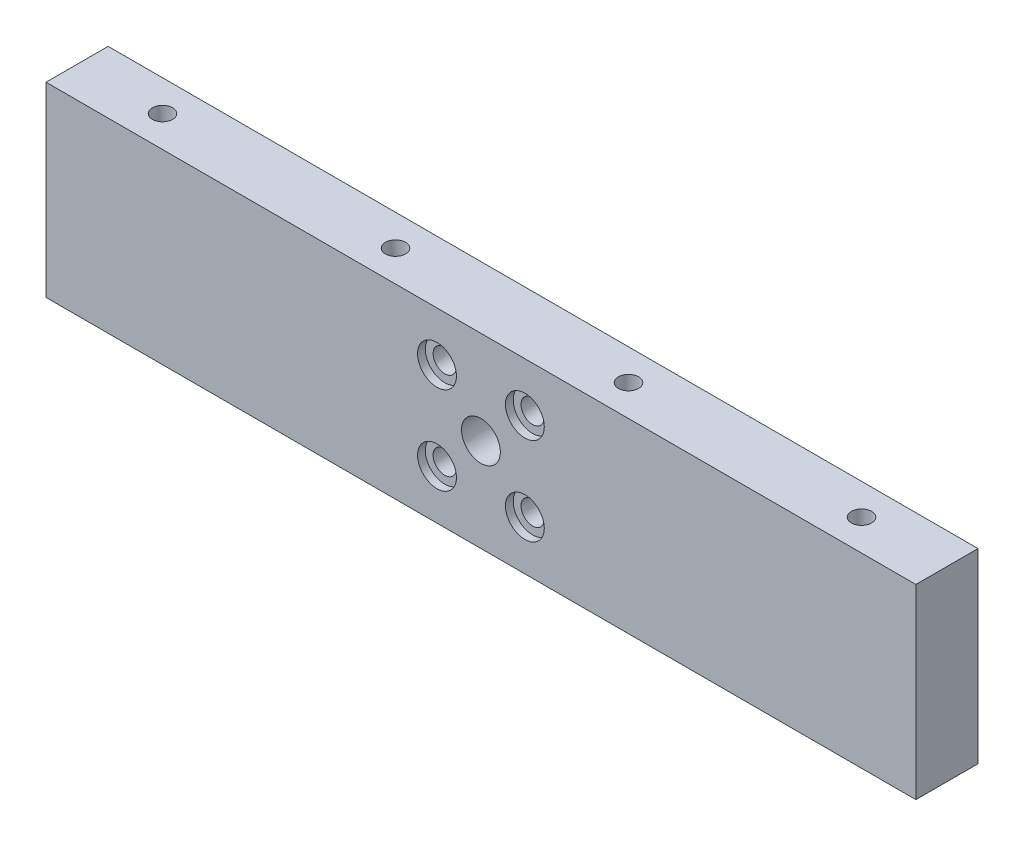
ISO-10303-21;
HEADER;
FILE_DESCRIPTION(('STEP AP214'),'2;1');
FILE_NAME('part.step','',(''),(''),'','','');
FILE_SCHEMA(('AUTOMOTIVE_DESIGN { 1 0 10303 214 1 1 1 1 }'));
ENDSEC;
DATA;
#1=APPLICATION_CONTEXT('core data for automotive mechanical design processes');
#2=APPLICATION_PROTOCOL_DEFINITION('international standard','automotive_design',2000,#1);
#3=PRODUCT_CONTEXT('',#1,'mechanical');
#4=PRODUCT('Part','Part','',(#3));
#5=PRODUCT_RELATED_PRODUCT_CATEGORY('part','',(#4));
#6=PRODUCT_DEFINITION_FORMATION('','',#4);
#7=PRODUCT_DEFINITION_CONTEXT('part definition',#1,'design');
#8=PRODUCT_DEFINITION('design','',#6,#7);
#9=PRODUCT_DEFINITION_SHAPE('','',#8);
#10=(LENGTH_UNIT() NAMED_UNIT(*) SI_UNIT(.MILLI.,.METRE.));
#11=(NAMED_UNIT(*) PLANE_ANGLE_UNIT() SI_UNIT($,.RADIAN.));
#12=(NAMED_UNIT(*) SI_UNIT($,.STERADIAN.) SOLID_ANGLE_UNIT());
#13=UNCERTAINTY_MEASURE_WITH_UNIT(LENGTH_MEASURE(1.E-05),#10,'distance_accuracy_value','');
#14=(GEOMETRIC_REPRESENTATION_CONTEXT(3) GLOBAL_UNCERTAINTY_ASSIGNED_CONTEXT((#13)) GLOBAL_UNIT_ASSIGNED_CONTEXT((#10,
#11,#12)) REPRESENTATION_CONTEXT('',''));
#15=CARTESIAN_POINT('',(0.,0.,0.));
#16=DIRECTION('',(0.,0.,1.));
#17=DIRECTION('',(1.,0.,0.));
#18=AXIS2_PLACEMENT_3D('',#15,#16,#17);
#19=CARTESIAN_POINT('',(-5.65685424949241,5.65685424949235,8.));
#20=DIRECTION('',(0.,0.,-1.));
#21=DIRECTION('',(-1.,0.,0.));
#22=AXIS2_PLACEMENT_3D('',#19,#20,#21);
#23=CYLINDRICAL_SURFACE('',#22,1.5);
#24=CARTESIAN_POINT('',(-5.65685424949241,5.65685424949235,0.));
#25=DIRECTION('',(0.,0.,-1.));
#26=DIRECTION('',(-1.,0.,0.));
#27=AXIS2_PLACEMENT_3D('',#24,#25,#26);
#28=CIRCLE('',#27,1.5);
#29=CARTESIAN_POINT('',(-7.15685424949241,5.65685424949235,0.));
#30=VERTEX_POINT('',#29);
#31=EDGE_CURVE('E162',#30,#30,#28,.T.);
#32=ORIENTED_EDGE('',*,*,#31,.T.);
#33=EDGE_LOOP('',(#32));
#34=FACE_BOUND('',#33,.T.);
#35=CARTESIAN_POINT('',(-5.65685424949241,5.65685424949235,7.));
#36=DIRECTION('',(0.,0.,1.));
#37=DIRECTION('',(1.,0.,0.));
#38=AXIS2_PLACEMENT_3D('',#35,#36,#37);
#39=CIRCLE('',#38,1.5);
#40=CARTESIAN_POINT('',(-4.15685424949241,5.65685424949235,7.));
#41=VERTEX_POINT('',#40);
#42=EDGE_CURVE('E39',#41,#41,#39,.F.);
#43=ORIENTED_EDGE('',*,*,#42,.F.);
#44=EDGE_LOOP('',(#43));
#45=FACE_BOUND('',#44,.T.);
#46=ADVANCED_FACE('F35',(#34,#45),#23,.F.);
#47=CARTESIAN_POINT('',(5.65685424949237,-5.65685424949239,8.));
#48=DIRECTION('',(0.,0.,-1.));
#49=DIRECTION('',(-1.,0.,0.));
#50=AXIS2_PLACEMENT_3D('',#47,#48,#49);
#51=CYLINDRICAL_SURFACE('',#50,1.5);
#52=CARTESIAN_POINT('',(5.65685424949237,-5.65685424949239,0.));
#53=DIRECTION('',(0.,0.,-1.));
#54=DIRECTION('',(-1.,0.,0.));
#55=AXIS2_PLACEMENT_3D('',#52,#53,#54);
#56=CIRCLE('',#55,1.5);
#57=CARTESIAN_POINT('',(4.15685424949237,-5.65685424949239,0.));
#58=VERTEX_POINT('',#57);
#59=EDGE_CURVE('E168',#58,#58,#56,.T.);
#60=ORIENTED_EDGE('',*,*,#59,.T.);
#61=EDGE_LOOP('',(#60));
#62=FACE_BOUND('',#61,.T.);
#63=CARTESIAN_POINT('',(5.65685424949237,-5.65685424949239,7.));
#64=DIRECTION('',(0.,0.,1.));
#65=DIRECTION('',(1.,0.,0.));
#66=AXIS2_PLACEMENT_3D('',#63,#64,#65);
#67=CIRCLE('',#66,1.5);
#68=CARTESIAN_POINT('',(7.15685424949237,-5.65685424949239,7.));
#69=VERTEX_POINT('',#68);
#70=EDGE_CURVE('E135',#69,#69,#67,.F.);
#71=ORIENTED_EDGE('',*,*,#70,.F.);
#72=EDGE_LOOP('',(#71));
#73=FACE_BOUND('',#72,.T.);
#74=ADVANCED_FACE('F202',(#62,#73),#51,.F.);
#75=CARTESIAN_POINT('',(5.65685424949239,5.65685424949237,8.));
#76=DIRECTION('',(0.,0.,-1.));
#77=DIRECTION('',(-1.,0.,0.));
#78=AXIS2_PLACEMENT_3D('',#75,#76,#77);
#79=CYLINDRICAL_SURFACE('',#78,1.49999999999999);
#80=CARTESIAN_POINT('',(5.65685424949239,5.65685424949237,0.));
#81=DIRECTION('',(0.,0.,-1.));
#82=DIRECTION('',(-1.,0.,0.));
#83=AXIS2_PLACEMENT_3D('',#80,#81,#82);
#84=CIRCLE('',#83,1.49999999999999);
#85=CARTESIAN_POINT('',(4.1568542494924,5.65685424949237,0.));
#86=VERTEX_POINT('',#85);
#87=EDGE_CURVE('E165',#86,#86,#84,.T.);
#88=ORIENTED_EDGE('',*,*,#87,.T.);
#89=EDGE_LOOP('',(#88));
#90=FACE_BOUND('',#89,.T.);
#91=CARTESIAN_POINT('',(5.65685424949239,5.65685424949237,7.));
#92=DIRECTION('',(0.,0.,1.));
#93=DIRECTION('',(1.,0.,0.));
#94=AXIS2_PLACEMENT_3D('',#91,#92,#93);
#95=CIRCLE('',#94,1.49999999999999);
#96=CARTESIAN_POINT('',(7.15685424949238,5.65685424949237,7.));
#97=VERTEX_POINT('',#96);
#98=EDGE_CURVE('E131',#97,#97,#95,.F.);
#99=ORIENTED_EDGE('',*,*,#98,.F.);
#100=EDGE_LOOP('',(#99));
#101=FACE_BOUND('',#100,.T.);
#102=ADVANCED_FACE('F208',(#90,#101),#79,.F.);
#103=CARTESIAN_POINT('',(-5.65685424949233,-5.65685424949243,8.));
#104=DIRECTION('',(0.,0.,-1.));
#105=DIRECTION('',(-1.,0.,0.));
#106=AXIS2_PLACEMENT_3D('',#103,#104,#105);
#107=CYLINDRICAL_SURFACE('',#106,1.5);
#108=CARTESIAN_POINT('',(-5.65685424949233,-5.65685424949243,0.));
#109=DIRECTION('',(0.,0.,-1.));
#110=DIRECTION('',(-1.,0.,0.));
#111=AXIS2_PLACEMENT_3D('',#108,#109,#110);
#112=CIRCLE('',#111,1.5);
#113=CARTESIAN_POINT('',(-7.15685424949233,-5.65685424949243,0.));
#114=VERTEX_POINT('',#113);
#115=EDGE_CURVE('E129',#114,#114,#112,.T.);
#116=ORIENTED_EDGE('',*,*,#115,.T.);
#117=EDGE_LOOP('',(#116));
#118=FACE_BOUND('',#117,.T.);
#119=CARTESIAN_POINT('',(-5.65685424949233,-5.65685424949243,7.));
#120=DIRECTION('',(0.,0.,1.));
#121=DIRECTION('',(1.,0.,0.));
#122=AXIS2_PLACEMENT_3D('',#119,#120,#121);
#123=CIRCLE('',#122,1.5);
#124=CARTESIAN_POINT('',(-4.15685424949233,-5.65685424949243,7.));
#125=VERTEX_POINT('',#124);
#126=EDGE_CURVE('E126',#125,#125,#123,.F.);
#127=ORIENTED_EDGE('',*,*,#126,.F.);
#128=EDGE_LOOP('',(#127));
#129=FACE_BOUND('',#128,.T.);
#130=ADVANCED_FACE('F197',(#118,#129),#107,.F.);
#131=CARTESIAN_POINT('',(56.,-12.,8.));
#132=DIRECTION('',(-1.,0.,0.));
#133=DIRECTION('',(0.,0.,1.));
#134=AXIS2_PLACEMENT_3D('',#131,#132,#133);
#135=PLANE('',#134);
#136=DIRECTION('',(0.,1.,0.));
#137=VECTOR('',#136,1.);
#138=CARTESIAN_POINT('',(56.,-12.,0.));
#139=LINE('',#138,#137);
#140=CARTESIAN_POINT('',(56.,-12.,0.));
#141=VERTEX_POINT('',#140);
#142=CARTESIAN_POINT('',(56.,12.,0.));
#143=VERTEX_POINT('',#142);
#144=EDGE_CURVE('E102',#141,#143,#139,.T.);
#145=ORIENTED_EDGE('',*,*,#144,.T.);
#146=DIRECTION('',(0.,0.,-1.));
#147=VECTOR('',#146,1.);
#148=CARTESIAN_POINT('',(56.,12.,8.));
#149=LINE('',#148,#147);
#150=CARTESIAN_POINT('',(56.,12.,8.));
#151=VERTEX_POINT('',#150);
#152=EDGE_CURVE('E11',#151,#143,#149,.T.);
#153=ORIENTED_EDGE('',*,*,#152,.F.);
#154=DIRECTION('',(0.,1.,0.));
#155=VECTOR('',#154,1.);
#156=CARTESIAN_POINT('',(56.,-12.,8.));
#157=LINE('',#156,#155);
#158=CARTESIAN_POINT('',(56.,-12.,8.));
#159=VERTEX_POINT('',#158);
#160=EDGE_CURVE('E89',#159,#151,#157,.T.);
#161=ORIENTED_EDGE('',*,*,#160,.F.);
#162=DIRECTION('',(0.,0.,-1.));
#163=VECTOR('',#162,1.);
#164=CARTESIAN_POINT('',(56.,-12.,8.));
#165=LINE('',#164,#163);
#166=EDGE_CURVE('E98',#159,#141,#165,.T.);
#167=ORIENTED_EDGE('',*,*,#166,.T.);
#168=EDGE_LOOP('',(#145,#153,#161,#167));
#169=FACE_BOUND('',#168,.T.);
#170=ADVANCED_FACE('F37',(#169),#135,.F.);
#171=CARTESIAN_POINT('',(-56.,12.,8.));
#172=DIRECTION('',(0.,-1.,0.));
#173=DIRECTION('',(0.,0.,-1.));
#174=AXIS2_PLACEMENT_3D('',#171,#172,#173);
#175=PLANE('',#174);
#176=CARTESIAN_POINT('',(15.0000000000001,12.,4.));
#177=DIRECTION('',(0.,1.,0.));
#178=DIRECTION('',(0.,0.,-1.));
#179=AXIS2_PLACEMENT_3D('',#176,#177,#178);
#180=CIRCLE('',#179,1.3);
#181=CARTESIAN_POINT('',(15.0000000000001,12.,2.7));
#182=VERTEX_POINT('',#181);
#183=EDGE_CURVE('E125',#182,#182,#180,.T.);
#184=ORIENTED_EDGE('',*,*,#183,.F.);
#185=EDGE_LOOP('',(#184));
#186=FACE_BOUND('',#185,.T.);
#187=CARTESIAN_POINT('',(45.0000000000001,12.,4.));
#188=DIRECTION('',(0.,1.,0.));
#189=DIRECTION('',(0.,0.,-1.));
#190=AXIS2_PLACEMENT_3D('',#187,#188,#189);
#191=CIRCLE('',#190,1.3);
#192=CARTESIAN_POINT('',(45.0000000000001,12.,2.7));
#193=VERTEX_POINT('',#192);
#194=EDGE_CURVE('E121',#193,#193,#191,.T.);
#195=ORIENTED_EDGE('',*,*,#194,.F.);
#196=EDGE_LOOP('',(#195));
#197=FACE_BOUND('',#196,.T.);
#198=CARTESIAN_POINT('',(-45.,12.,4.));
#199=DIRECTION('',(0.,1.,0.));
#200=DIRECTION('',(0.,0.,1.));
#201=AXIS2_PLACEMENT_3D('',#198,#199,#200);
#202=CIRCLE('',#201,1.3);
#203=CARTESIAN_POINT('',(-45.,12.,5.3));
#204=VERTEX_POINT('',#203);
#205=EDGE_CURVE('E117',#204,#204,#202,.T.);
#206=ORIENTED_EDGE('',*,*,#205,.F.);
#207=EDGE_LOOP('',(#206));
#208=FACE_BOUND('',#207,.T.);
#209=CARTESIAN_POINT('',(-15.,12.,4.));
#210=DIRECTION('',(0.,1.,0.));
#211=DIRECTION('',(0.,0.,1.));
#212=AXIS2_PLACEMENT_3D('',#209,#210,#211);
#213=CIRCLE('',#212,1.3);
#214=CARTESIAN_POINT('',(-15.,12.,5.3));
#215=VERTEX_POINT('',#214);
#216=EDGE_CURVE('E113',#215,#215,#213,.T.);
#217=ORIENTED_EDGE('',*,*,#216,.F.);
#218=EDGE_LOOP('',(#217));
#219=FACE_BOUND('',#218,.T.);
#220=DIRECTION('',(-1.,0.,0.));
#221=VECTOR('',#220,1.);
#222=CARTESIAN_POINT('',(-56.,12.,0.));
#223=LINE('',#222,#221);
#224=CARTESIAN_POINT('',(-56.,12.,0.));
#225=VERTEX_POINT('',#224);
#226=EDGE_CURVE('E93',#143,#225,#223,.T.);
#227=ORIENTED_EDGE('',*,*,#226,.T.);
#228=DIRECTION('',(0.,0.,-1.));
#229=VECTOR('',#228,1.);
#230=CARTESIAN_POINT('',(-56.,12.,8.));
#231=LINE('',#230,#229);
#232=CARTESIAN_POINT('',(-56.,12.,8.));
#233=VERTEX_POINT('',#232);
#234=EDGE_CURVE('E45',#233,#225,#231,.T.);
#235=ORIENTED_EDGE('',*,*,#234,.F.);
#236=DIRECTION('',(-1.,0.,0.));
#237=VECTOR('',#236,1.);
#238=CARTESIAN_POINT('',(-56.,12.,8.));
#239=LINE('',#238,#237);
#240=EDGE_CURVE('E84',#151,#233,#239,.T.);
#241=ORIENTED_EDGE('',*,*,#240,.F.);
#242=ORIENTED_EDGE('',*,*,#152,.T.);
#243=EDGE_LOOP('',(#227,#235,#241,#242));
#244=FACE_BOUND('',#243,.T.);
#245=ADVANCED_FACE('F92',(#186,#197,#208,#219,#244),#175,.F.);
#246=CARTESIAN_POINT('',(-56.,-12.,8.));
#247=DIRECTION('',(1.,0.,0.));
#248=DIRECTION('',(0.,0.,-1.));
#249=AXIS2_PLACEMENT_3D('',#246,#247,#248);
#250=PLANE('',#249);
#251=DIRECTION('',(0.,-1.,0.));
#252=VECTOR('',#251,1.);
#253=CARTESIAN_POINT('',(-56.,-12.,0.));
#254=LINE('',#253,#252);
#255=CARTESIAN_POINT('',(-56.,-12.,0.));
#256=VERTEX_POINT('',#255);
#257=EDGE_CURVE('E71',#225,#256,#254,.T.);
#258=ORIENTED_EDGE('',*,*,#257,.T.);
#259=DIRECTION('',(0.,0.,-1.));
#260=VECTOR('',#259,1.);
#261=CARTESIAN_POINT('',(-56.,-12.,8.));
#262=LINE('',#261,#260);
#263=CARTESIAN_POINT('',(-56.,-12.,8.));
#264=VERTEX_POINT('',#263);
#265=EDGE_CURVE('E94',#264,#256,#262,.T.);
#266=ORIENTED_EDGE('',*,*,#265,.F.);
#267=DIRECTION('',(0.,-1.,0.));
#268=VECTOR('',#267,1.);
#269=CARTESIAN_POINT('',(-56.,-12.,8.));
#270=LINE('',#269,#268);
#271=EDGE_CURVE('E87',#233,#264,#270,.T.);
#272=ORIENTED_EDGE('',*,*,#271,.F.);
#273=ORIENTED_EDGE('',*,*,#234,.T.);
#274=EDGE_LOOP('',(#258,#266,#272,#273));
#275=FACE_BOUND('',#274,.T.);
#276=ADVANCED_FACE('F96',(#275),#250,.F.);
#277=CARTESIAN_POINT('',(-56.,-12.,8.));
#278=DIRECTION('',(0.,1.,0.));
#279=DIRECTION('',(0.,0.,1.));
#280=AXIS2_PLACEMENT_3D('',#277,#278,#279);
#281=PLANE('',#280);
#282=CARTESIAN_POINT('',(15.0000000000001,-12.,4.));
#283=DIRECTION('',(0.,1.,0.));
#284=DIRECTION('',(0.,0.,1.));
#285=AXIS2_PLACEMENT_3D('',#282,#283,#284);
#286=CIRCLE('',#285,1.3);
#287=CARTESIAN_POINT('',(15.0000000000001,-12.,5.3));
#288=VERTEX_POINT('',#287);
#289=EDGE_CURVE('E122',#288,#288,#286,.T.);
#290=ORIENTED_EDGE('',*,*,#289,.T.);
#291=EDGE_LOOP('',(#290));
#292=FACE_BOUND('',#291,.T.);
#293=CARTESIAN_POINT('',(45.0000000000001,-12.,4.));
#294=DIRECTION('',(0.,1.,0.));
#295=DIRECTION('',(0.,0.,1.));
#296=AXIS2_PLACEMENT_3D('',#293,#294,#295);
#297=CIRCLE('',#296,1.3);
#298=CARTESIAN_POINT('',(45.0000000000001,-12.,5.3));
#299=VERTEX_POINT('',#298);
#300=EDGE_CURVE('E118',#299,#299,#297,.T.);
#301=ORIENTED_EDGE('',*,*,#300,.T.);
#302=EDGE_LOOP('',(#301));
#303=FACE_BOUND('',#302,.T.);
#304=CARTESIAN_POINT('',(-45.,-12.,4.));
#305=DIRECTION('',(0.,1.,0.));
#306=DIRECTION('',(0.,0.,1.));
#307=AXIS2_PLACEMENT_3D('',#304,#305,#306);
#308=CIRCLE('',#307,1.3);
#309=CARTESIAN_POINT('',(-45.,-12.,5.3));
#310=VERTEX_POINT('',#309);
#311=EDGE_CURVE('E114',#310,#310,#308,.T.);
#312=ORIENTED_EDGE('',*,*,#311,.T.);
#313=EDGE_LOOP('',(#312));
#314=FACE_BOUND('',#313,.T.);
#315=CARTESIAN_POINT('',(-15.,-12.,4.));
#316=DIRECTION('',(0.,1.,0.));
#317=DIRECTION('',(0.,0.,1.));
#318=AXIS2_PLACEMENT_3D('',#315,#316,#317);
#319=CIRCLE('',#318,1.3);
#320=CARTESIAN_POINT('',(-15.,-12.,5.3));
#321=VERTEX_POINT('',#320);
#322=EDGE_CURVE('E105',#321,#321,#319,.T.);
#323=ORIENTED_EDGE('',*,*,#322,.T.);
#324=EDGE_LOOP('',(#323));
#325=FACE_BOUND('',#324,.T.);
#326=DIRECTION('',(1.,0.,0.));
#327=VECTOR('',#326,1.);
#328=CARTESIAN_POINT('',(-56.,-12.,0.));
#329=LINE('',#328,#327);
#330=EDGE_CURVE('E77',#256,#141,#329,.T.);
#331=ORIENTED_EDGE('',*,*,#330,.T.);
#332=ORIENTED_EDGE('',*,*,#166,.F.);
#333=DIRECTION('',(1.,0.,0.));
#334=VECTOR('',#333,1.);
#335=CARTESIAN_POINT('',(-56.,-12.,8.));
#336=LINE('',#335,#334);
#337=EDGE_CURVE('E54',#264,#159,#336,.T.);
#338=ORIENTED_EDGE('',*,*,#337,.F.);
#339=ORIENTED_EDGE('',*,*,#265,.T.);
#340=EDGE_LOOP('',(#331,#332,#338,#339));
#341=FACE_BOUND('',#340,.T.);
#342=ADVANCED_FACE('F195',(#292,#303,#314,#325,#341),#281,.F.);
#343=CARTESIAN_POINT('',(0.,0.,8.));
#344=DIRECTION('',(0.,0.,-1.));
#345=DIRECTION('',(-1.,0.,0.));
#346=AXIS2_PLACEMENT_3D('',#343,#344,#345);
#347=PLANE('',#346);
#348=CARTESIAN_POINT('',(-5.65685424949241,5.65685424949235,8.));
#349=DIRECTION('',(0.,0.,1.));
#350=DIRECTION('',(1.,0.,0.));
#351=AXIS2_PLACEMENT_3D('',#348,#349,#350);
#352=CIRCLE('',#351,2.5);
#353=CARTESIAN_POINT('',(-3.15685424949241,5.65685424949235,8.));
#354=VERTEX_POINT('',#353);
#355=EDGE_CURVE('E151',#354,#354,#352,.T.);
#356=ORIENTED_EDGE('',*,*,#355,.F.);
#357=EDGE_LOOP('',(#356));
#358=FACE_BOUND('',#357,.T.);
#359=CARTESIAN_POINT('',(5.65685424949237,-5.65685424949239,8.));
#360=DIRECTION('',(0.,0.,1.));
#361=DIRECTION('',(1.,0.,0.));
#362=AXIS2_PLACEMENT_3D('',#359,#360,#361);
#363=CIRCLE('',#362,2.5);
#364=CARTESIAN_POINT('',(8.15685424949237,-5.65685424949239,8.));
#365=VERTEX_POINT('',#364);
#366=EDGE_CURVE('E144',#365,#365,#363,.T.);
#367=ORIENTED_EDGE('',*,*,#366,.F.);
#368=EDGE_LOOP('',(#367));
#369=FACE_BOUND('',#368,.T.);
#370=CARTESIAN_POINT('',(5.65685424949239,5.65685424949237,8.));
#371=DIRECTION('',(0.,0.,1.));
#372=DIRECTION('',(1.,0.,0.));
#373=AXIS2_PLACEMENT_3D('',#370,#371,#372);
#374=CIRCLE('',#373,2.5);
#375=CARTESIAN_POINT('',(8.15685424949239,5.65685424949237,8.));
#376=VERTEX_POINT('',#375);
#377=EDGE_CURVE('E137',#376,#376,#374,.T.);
#378=ORIENTED_EDGE('',*,*,#377,.F.);
#379=EDGE_LOOP('',(#378));
#380=FACE_BOUND('',#379,.T.);
#381=CARTESIAN_POINT('',(-5.65685424949233,-5.65685424949243,8.));
#382=DIRECTION('',(0.,0.,1.));
#383=DIRECTION('',(1.,0.,0.));
#384=AXIS2_PLACEMENT_3D('',#381,#382,#383);
#385=CIRCLE('',#384,2.5);
#386=CARTESIAN_POINT('',(-3.15685424949233,-5.65685424949243,8.));
#387=VERTEX_POINT('',#386);
#388=EDGE_CURVE('E133',#387,#387,#385,.T.);
#389=ORIENTED_EDGE('',*,*,#388,.F.);
#390=EDGE_LOOP('',(#389));
#391=FACE_BOUND('',#390,.T.);
#392=CARTESIAN_POINT('',(0.,0.,8.));
#393=DIRECTION('',(0.,0.,-1.));
#394=DIRECTION('',(-1.,0.,0.));
#395=AXIS2_PLACEMENT_3D('',#392,#393,#394);
#396=CIRCLE('',#395,2.5);
#397=CARTESIAN_POINT('',(-2.5,0.,8.));
#398=VERTEX_POINT('',#397);
#399=EDGE_CURVE('E172',#398,#398,#396,.T.);
#400=ORIENTED_EDGE('',*,*,#399,.T.);
#401=EDGE_LOOP('',(#400));
#402=FACE_BOUND('',#401,.T.);
#403=ORIENTED_EDGE('',*,*,#160,.T.);
#404=ORIENTED_EDGE('',*,*,#240,.T.);
#405=ORIENTED_EDGE('',*,*,#271,.T.);
#406=ORIENTED_EDGE('',*,*,#337,.T.);
#407=EDGE_LOOP('',(#403,#404,#405,#406));
#408=FACE_BOUND('',#407,.T.);
#409=ADVANCED_FACE('F85',(#358,#369,#380,#391,#402,#408),#347,.F.);
#410=CARTESIAN_POINT('',(0.,0.,0.));
#411=DIRECTION('',(0.,0.,-1.));
#412=DIRECTION('',(-1.,0.,0.));
#413=AXIS2_PLACEMENT_3D('',#410,#411,#412);
#414=PLANE('',#413);
#415=ORIENTED_EDGE('',*,*,#115,.F.);
#416=EDGE_LOOP('',(#415));
#417=FACE_BOUND('',#416,.T.);
#418=ORIENTED_EDGE('',*,*,#31,.F.);
#419=EDGE_LOOP('',(#418));
#420=FACE_BOUND('',#419,.T.);
#421=ORIENTED_EDGE('',*,*,#87,.F.);
#422=EDGE_LOOP('',(#421));
#423=FACE_BOUND('',#422,.T.);
#424=ORIENTED_EDGE('',*,*,#59,.F.);
#425=EDGE_LOOP('',(#424));
#426=FACE_BOUND('',#425,.T.);
#427=CARTESIAN_POINT('',(0.,0.,0.));
#428=DIRECTION('',(0.,0.,-1.));
#429=DIRECTION('',(-1.,0.,0.));
#430=AXIS2_PLACEMENT_3D('',#427,#428,#429);
#431=CIRCLE('',#430,2.5);
#432=CARTESIAN_POINT('',(-2.5,0.,0.));
#433=VERTEX_POINT('',#432);
#434=EDGE_CURVE('E171',#433,#433,#431,.T.);
#435=ORIENTED_EDGE('',*,*,#434,.F.);
#436=EDGE_LOOP('',(#435));
#437=FACE_BOUND('',#436,.T.);
#438=ORIENTED_EDGE('',*,*,#144,.F.);
#439=ORIENTED_EDGE('',*,*,#330,.F.);
#440=ORIENTED_EDGE('',*,*,#257,.F.);
#441=ORIENTED_EDGE('',*,*,#226,.F.);
#442=EDGE_LOOP('',(#438,#439,#440,#441));
#443=FACE_BOUND('',#442,.T.);
#444=ADVANCED_FACE('F237',(#417,#420,#423,#426,#437,#443),#414,.T.);
#445=CARTESIAN_POINT('',(-15.,-18.,4.));
#446=DIRECTION('',(0.,1.,0.));
#447=DIRECTION('',(0.,0.,1.));
#448=AXIS2_PLACEMENT_3D('',#445,#446,#447);
#449=CYLINDRICAL_SURFACE('',#448,1.3);
#450=ORIENTED_EDGE('',*,*,#216,.T.);
#451=EDGE_LOOP('',(#450));
#452=FACE_BOUND('',#451,.T.);
#453=ORIENTED_EDGE('',*,*,#322,.F.);
#454=EDGE_LOOP('',(#453));
#455=FACE_BOUND('',#454,.T.);
#456=ADVANCED_FACE('F186',(#452,#455),#449,.F.);
#457=CARTESIAN_POINT('',(-45.,-18.,4.));
#458=DIRECTION('',(0.,1.,0.));
#459=DIRECTION('',(0.,0.,1.));
#460=AXIS2_PLACEMENT_3D('',#457,#458,#459);
#461=CYLINDRICAL_SURFACE('',#460,1.3);
#462=ORIENTED_EDGE('',*,*,#205,.T.);
#463=EDGE_LOOP('',(#462));
#464=FACE_BOUND('',#463,.T.);
#465=ORIENTED_EDGE('',*,*,#311,.F.);
#466=EDGE_LOOP('',(#465));
#467=FACE_BOUND('',#466,.T.);
#468=ADVANCED_FACE('F230',(#464,#467),#461,.F.);
#469=CARTESIAN_POINT('',(45.0000000000001,-18.,4.));
#470=DIRECTION('',(0.,1.,0.));
#471=DIRECTION('',(0.,0.,1.));
#472=AXIS2_PLACEMENT_3D('',#469,#470,#471);
#473=CYLINDRICAL_SURFACE('',#472,1.3);
#474=ORIENTED_EDGE('',*,*,#194,.T.);
#475=EDGE_LOOP('',(#474));
#476=FACE_BOUND('',#475,.T.);
#477=ORIENTED_EDGE('',*,*,#300,.F.);
#478=EDGE_LOOP('',(#477));
#479=FACE_BOUND('',#478,.T.);
#480=ADVANCED_FACE('F226',(#476,#479),#473,.F.);
#481=CARTESIAN_POINT('',(15.0000000000001,-18.,4.));
#482=DIRECTION('',(0.,1.,0.));
#483=DIRECTION('',(0.,0.,1.));
#484=AXIS2_PLACEMENT_3D('',#481,#482,#483);
#485=CYLINDRICAL_SURFACE('',#484,1.3);
#486=ORIENTED_EDGE('',*,*,#183,.T.);
#487=EDGE_LOOP('',(#486));
#488=FACE_BOUND('',#487,.T.);
#489=ORIENTED_EDGE('',*,*,#289,.F.);
#490=EDGE_LOOP('',(#489));
#491=FACE_BOUND('',#490,.T.);
#492=ADVANCED_FACE('F222',(#488,#491),#485,.F.);
#493=CARTESIAN_POINT('',(0.,0.,8.));
#494=DIRECTION('',(0.,0.,-1.));
#495=DIRECTION('',(-1.,0.,0.));
#496=AXIS2_PLACEMENT_3D('',#493,#494,#495);
#497=CYLINDRICAL_SURFACE('',#496,2.5);
#498=ORIENTED_EDGE('',*,*,#399,.F.);
#499=EDGE_LOOP('',(#498));
#500=FACE_BOUND('',#499,.T.);
#501=ORIENTED_EDGE('',*,*,#434,.T.);
#502=EDGE_LOOP('',(#501));
#503=FACE_BOUND('',#502,.T.);
#504=ADVANCED_FACE('F218',(#500,#503),#497,.F.);
#505=CARTESIAN_POINT('',(-5.65685424949233,-5.65685424949243,7.));
#506=DIRECTION('',(0.,0.,1.));
#507=DIRECTION('',(1.,0.,0.));
#508=AXIS2_PLACEMENT_3D('',#505,#506,#507);
#509=PLANE('',#508);
#510=CARTESIAN_POINT('',(-5.65685424949233,-5.65685424949243,7.));
#511=DIRECTION('',(0.,0.,1.));
#512=DIRECTION('',(1.,0.,0.));
#513=AXIS2_PLACEMENT_3D('',#510,#511,#512);
#514=CIRCLE('',#513,2.5);
#515=CARTESIAN_POINT('',(-3.15685424949233,-5.65685424949243,7.));
#516=VERTEX_POINT('',#515);
#517=EDGE_CURVE('E130',#516,#516,#514,.T.);
#518=ORIENTED_EDGE('',*,*,#517,.T.);
#519=EDGE_LOOP('',(#518));
#520=FACE_BOUND('',#519,.T.);
#521=ORIENTED_EDGE('',*,*,#126,.T.);
#522=EDGE_LOOP('',(#521));
#523=FACE_BOUND('',#522,.T.);
#524=ADVANCED_FACE('F221',(#520,#523),#509,.T.);
#525=CARTESIAN_POINT('',(-5.65685424949233,-5.65685424949243,7.));
#526=DIRECTION('',(0.,0.,1.));
#527=DIRECTION('',(1.,0.,0.));
#528=AXIS2_PLACEMENT_3D('',#525,#526,#527);
#529=CYLINDRICAL_SURFACE('',#528,2.5);
#530=ORIENTED_EDGE('',*,*,#517,.F.);
#531=EDGE_LOOP('',(#530));
#532=FACE_BOUND('',#531,.T.);
#533=ORIENTED_EDGE('',*,*,#388,.T.);
#534=EDGE_LOOP('',(#533));
#535=FACE_BOUND('',#534,.T.);
#536=ADVANCED_FACE('F295',(#532,#535),#529,.F.);
#537=CARTESIAN_POINT('',(5.65685424949239,5.65685424949237,7.));
#538=DIRECTION('',(0.,0.,1.));
#539=DIRECTION('',(1.,0.,0.));
#540=AXIS2_PLACEMENT_3D('',#537,#538,#539);
#541=PLANE('',#540);
#542=CARTESIAN_POINT('',(5.65685424949239,5.65685424949237,7.));
#543=DIRECTION('',(0.,0.,1.));
#544=DIRECTION('',(1.,0.,0.));
#545=AXIS2_PLACEMENT_3D('',#542,#543,#544);
#546=CIRCLE('',#545,2.5);
#547=CARTESIAN_POINT('',(8.15685424949239,5.65685424949237,7.));
#548=VERTEX_POINT('',#547);
#549=EDGE_CURVE('E134',#548,#548,#546,.T.);
#550=ORIENTED_EDGE('',*,*,#549,.T.);
#551=EDGE_LOOP('',(#550));
#552=FACE_BOUND('',#551,.T.);
#553=ORIENTED_EDGE('',*,*,#98,.T.);
#554=EDGE_LOOP('',(#553));
#555=FACE_BOUND('',#554,.T.);
#556=ADVANCED_FACE('F303',(#552,#555),#541,.T.);
#557=CARTESIAN_POINT('',(5.65685424949239,5.65685424949237,7.));
#558=DIRECTION('',(0.,0.,1.));
#559=DIRECTION('',(1.,0.,0.));
#560=AXIS2_PLACEMENT_3D('',#557,#558,#559);
#561=CYLINDRICAL_SURFACE('',#560,2.5);
#562=ORIENTED_EDGE('',*,*,#549,.F.);
#563=EDGE_LOOP('',(#562));
#564=FACE_BOUND('',#563,.T.);
#565=ORIENTED_EDGE('',*,*,#377,.T.);
#566=EDGE_LOOP('',(#565));
#567=FACE_BOUND('',#566,.T.);
#568=ADVANCED_FACE('F310',(#564,#567),#561,.F.);
#569=CARTESIAN_POINT('',(5.65685424949237,-5.65685424949239,7.));
#570=DIRECTION('',(0.,0.,1.));
#571=DIRECTION('',(1.,0.,0.));
#572=AXIS2_PLACEMENT_3D('',#569,#570,#571);
#573=PLANE('',#572);
#574=CARTESIAN_POINT('',(5.65685424949237,-5.65685424949239,7.));
#575=DIRECTION('',(0.,0.,1.));
#576=DIRECTION('',(1.,0.,0.));
#577=AXIS2_PLACEMENT_3D('',#574,#575,#576);
#578=CIRCLE('',#577,2.5);
#579=CARTESIAN_POINT('',(8.15685424949237,-5.65685424949239,7.));
#580=VERTEX_POINT('',#579);
#581=EDGE_CURVE('E138',#580,#580,#578,.T.);
#582=ORIENTED_EDGE('',*,*,#581,.T.);
#583=EDGE_LOOP('',(#582));
#584=FACE_BOUND('',#583,.T.);
#585=ORIENTED_EDGE('',*,*,#70,.T.);
#586=EDGE_LOOP('',(#585));
#587=FACE_BOUND('',#586,.T.);
#588=ADVANCED_FACE('F318',(#584,#587),#573,.T.);
#589=CARTESIAN_POINT('',(5.65685424949237,-5.65685424949239,7.));
#590=DIRECTION('',(0.,0.,1.));
#591=DIRECTION('',(1.,0.,0.));
#592=AXIS2_PLACEMENT_3D('',#589,#590,#591);
#593=CYLINDRICAL_SURFACE('',#592,2.5);
#594=ORIENTED_EDGE('',*,*,#581,.F.);
#595=EDGE_LOOP('',(#594));
#596=FACE_BOUND('',#595,.T.);
#597=ORIENTED_EDGE('',*,*,#366,.T.);
#598=EDGE_LOOP('',(#597));
#599=FACE_BOUND('',#598,.T.);
#600=ADVANCED_FACE('F326',(#596,#599),#593,.F.);
#601=CARTESIAN_POINT('',(-5.65685424949241,5.65685424949235,7.));
#602=DIRECTION('',(0.,0.,1.));
#603=DIRECTION('',(1.,0.,0.));
#604=AXIS2_PLACEMENT_3D('',#601,#602,#603);
#605=PLANE('',#604);
#606=CARTESIAN_POINT('',(-5.65685424949241,5.65685424949235,7.));
#607=DIRECTION('',(0.,0.,1.));
#608=DIRECTION('',(1.,0.,0.));
#609=AXIS2_PLACEMENT_3D('',#606,#607,#608);
#610=CIRCLE('',#609,2.5);
#611=CARTESIAN_POINT('',(-3.15685424949241,5.65685424949235,7.));
#612=VERTEX_POINT('',#611);
#613=EDGE_CURVE('E443',#612,#612,#610,.T.);
#614=ORIENTED_EDGE('',*,*,#613,.T.);
#615=EDGE_LOOP('',(#614));
#616=FACE_BOUND('',#615,.T.);
#617=ORIENTED_EDGE('',*,*,#42,.T.);
#618=EDGE_LOOP('',(#617));
#619=FACE_BOUND('',#618,.T.);
#620=ADVANCED_FACE('F333',(#616,#619),#605,.T.);
#621=CARTESIAN_POINT('',(-5.65685424949241,5.65685424949235,7.));
#622=DIRECTION('',(0.,0.,1.));
#623=DIRECTION('',(1.,0.,0.));
#624=AXIS2_PLACEMENT_3D('',#621,#622,#623);
#625=CYLINDRICAL_SURFACE('',#624,2.5);
#626=ORIENTED_EDGE('',*,*,#613,.F.);
#627=EDGE_LOOP('',(#626));
#628=FACE_BOUND('',#627,.T.);
#629=ORIENTED_EDGE('',*,*,#355,.T.);
#630=EDGE_LOOP('',(#629));
#631=FACE_BOUND('',#630,.T.);
#632=ADVANCED_FACE('F341',(#628,#631),#625,.F.);
#633=CLOSED_SHELL('',(#46,#74,#102,#130,#170,#245,#276,#342,#409,#444,#456,#468,#480,#492,#504,
#524,#536,#556,#568,#588,#600,#620,#632));
#634=MANIFOLD_SOLID_BREP('B2',#633);
#635=ADVANCED_BREP_SHAPE_REPRESENTATION('',(#18,#634),#14);
#636=SHAPE_DEFINITION_REPRESENTATION(#9,#635);
ENDSEC;
END-ISO-10303-21;
